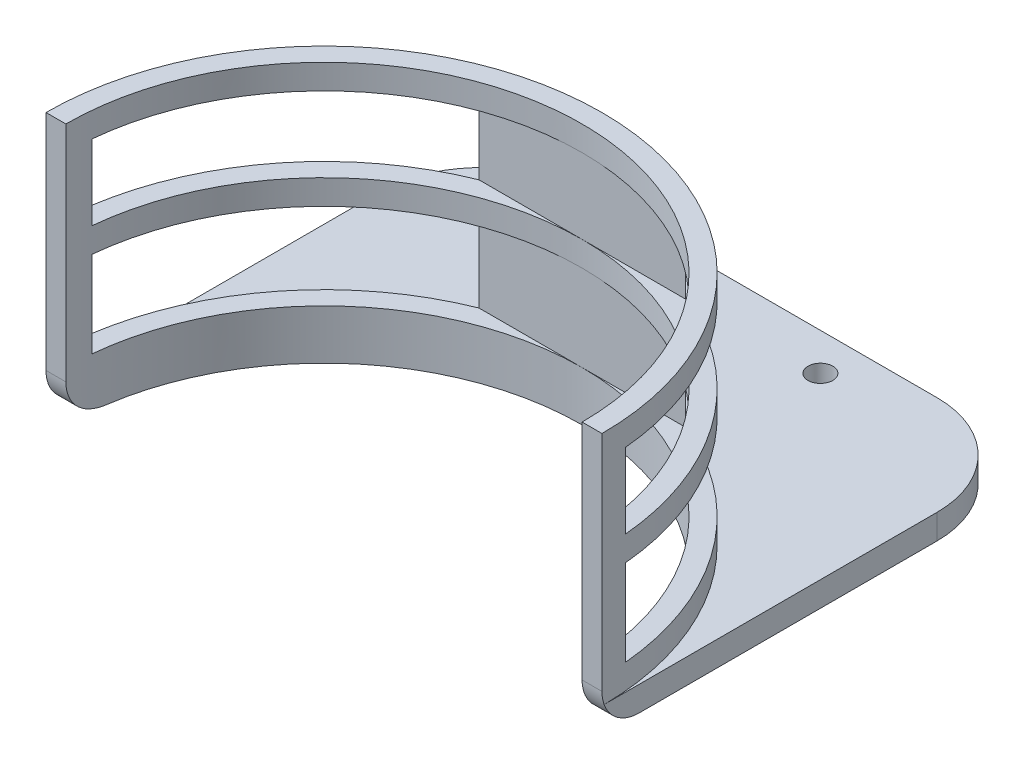
ISO-10303-21;
HEADER;
FILE_DESCRIPTION(('STEP AP214'),'2;1');
FILE_NAME('part.step','',(''),(''),'','','');
FILE_SCHEMA(('AUTOMOTIVE_DESIGN { 1 0 10303 214 1 1 1 1 }'));
ENDSEC;
DATA;
#1=APPLICATION_CONTEXT('core data for automotive mechanical design processes');
#2=APPLICATION_PROTOCOL_DEFINITION('international standard','automotive_design',2000,#1);
#3=PRODUCT_CONTEXT('',#1,'mechanical');
#4=PRODUCT('Part','Part','',(#3));
#5=PRODUCT_RELATED_PRODUCT_CATEGORY('part','',(#4));
#6=PRODUCT_DEFINITION_FORMATION('','',#4);
#7=PRODUCT_DEFINITION_CONTEXT('part definition',#1,'design');
#8=PRODUCT_DEFINITION('design','',#6,#7);
#9=PRODUCT_DEFINITION_SHAPE('','',#8);
#10=(LENGTH_UNIT() NAMED_UNIT(*) SI_UNIT(.MILLI.,.METRE.));
#11=(NAMED_UNIT(*) PLANE_ANGLE_UNIT() SI_UNIT($,.RADIAN.));
#12=(NAMED_UNIT(*) SI_UNIT($,.STERADIAN.) SOLID_ANGLE_UNIT());
#13=UNCERTAINTY_MEASURE_WITH_UNIT(LENGTH_MEASURE(1.E-05),#10,'distance_accuracy_value','');
#14=(GEOMETRIC_REPRESENTATION_CONTEXT(3) GLOBAL_UNCERTAINTY_ASSIGNED_CONTEXT((#13)) GLOBAL_UNIT_ASSIGNED_CONTEXT((#10,
#11,#12)) REPRESENTATION_CONTEXT('',''));
#15=CARTESIAN_POINT('',(0.,0.,0.));
#16=DIRECTION('',(0.,0.,1.));
#17=DIRECTION('',(1.,0.,0.));
#18=AXIS2_PLACEMENT_3D('',#15,#16,#17);
#19=CARTESIAN_POINT('',(-22.4,19.,0.));
#20=DIRECTION('',(0.,0.,-1.));
#21=DIRECTION('',(-1.,0.,0.));
#22=AXIS2_PLACEMENT_3D('',#19,#20,#21);
#23=PLANE('',#22);
#24=DIRECTION('',(0.,-1.,0.));
#25=VECTOR('',#24,1.);
#26=CARTESIAN_POINT('',(-22.4,19.,0.));
#27=LINE('',#26,#25);
#28=CARTESIAN_POINT('',(-22.4,19.,0.));
#29=VERTEX_POINT('',#28);
#30=CARTESIAN_POINT('',(-22.4,1.,0.));
#31=VERTEX_POINT('',#30);
#32=EDGE_CURVE('E392',#29,#31,#27,.T.);
#33=ORIENTED_EDGE('',*,*,#32,.T.);
#34=DIRECTION('',(-1.,0.,0.));
#35=VECTOR('',#34,1.);
#36=CARTESIAN_POINT('',(-20.8,1.,0.));
#37=LINE('',#36,#35);
#38=CARTESIAN_POINT('',(-20.8,1.,0.));
#39=VERTEX_POINT('',#38);
#40=EDGE_CURVE('E65',#31,#39,#37,.F.);
#41=ORIENTED_EDGE('',*,*,#40,.T.);
#42=DIRECTION('',(0.,-1.,0.));
#43=VECTOR('',#42,1.);
#44=CARTESIAN_POINT('',(-20.8,19.,0.));
#45=LINE('',#44,#43);
#46=CARTESIAN_POINT('',(-20.8,19.,0.));
#47=VERTEX_POINT('',#46);
#48=EDGE_CURVE('E390',#47,#39,#45,.T.);
#49=ORIENTED_EDGE('',*,*,#48,.F.);
#50=DIRECTION('',(1.,0.,0.));
#51=VECTOR('',#50,1.);
#52=CARTESIAN_POINT('',(-22.4,19.,0.));
#53=LINE('',#52,#51);
#54=EDGE_CURVE('E388',#29,#47,#53,.T.);
#55=ORIENTED_EDGE('',*,*,#54,.F.);
#56=EDGE_LOOP('',(#33,#41,#49,#55));
#57=FACE_BOUND('',#56,.T.);
#58=ADVANCED_FACE('F41',(#57),#23,.F.);
#59=CARTESIAN_POINT('',(0.,19.,0.));
#60=DIRECTION('',(0.,-1.,0.));
#61=DIRECTION('',(0.,0.,-1.));
#62=AXIS2_PLACEMENT_3D('',#59,#60,#61);
#63=CYLINDRICAL_SURFACE('',#62,20.8);
#64=DIRECTION('',(0.,-1.,0.));
#65=VECTOR('',#64,1.);
#66=CARTESIAN_POINT('',(-20.703622871372,19.,-2.00000000000001));
#67=LINE('',#66,#65);
#68=CARTESIAN_POINT('',(-20.703622871372,1.99999999999999,-2.));
#69=VERTEX_POINT('',#68);
#70=CARTESIAN_POINT('',(-20.703622871372,8.94485109083248,-2.));
#71=VERTEX_POINT('',#70);
#72=EDGE_CURVE('E452',#69,#71,#67,.F.);
#73=ORIENTED_EDGE('',*,*,#72,.T.);
#74=CARTESIAN_POINT('',(0.,8.94485109083248,0.));
#75=DIRECTION('',(0.,1.,0.));
#76=DIRECTION('',(0.,0.,1.));
#77=AXIS2_PLACEMENT_3D('',#74,#75,#76);
#78=CIRCLE('',#77,20.8);
#79=CARTESIAN_POINT('',(0.,8.94485109083248,-20.8));
#80=VERTEX_POINT('',#79);
#81=EDGE_CURVE('E458',#71,#80,#78,.F.);
#82=ORIENTED_EDGE('',*,*,#81,.T.);
#83=CARTESIAN_POINT('',(20.703622871372,8.94485109083248,-2.));
#84=VERTEX_POINT('',#83);
#85=EDGE_CURVE('E455',#80,#84,#78,.F.);
#86=ORIENTED_EDGE('',*,*,#85,.T.);
#87=DIRECTION('',(0.,-1.,0.));
#88=VECTOR('',#87,1.);
#89=CARTESIAN_POINT('',(20.703622871372,19.,-2.));
#90=LINE('',#89,#88);
#91=CARTESIAN_POINT('',(20.703622871372,1.99999999999999,-2.));
#92=VERTEX_POINT('',#91);
#93=EDGE_CURVE('E449',#84,#92,#90,.T.);
#94=ORIENTED_EDGE('',*,*,#93,.T.);
#95=CARTESIAN_POINT('',(0.,1.99999999999999,0.));
#96=DIRECTION('',(0.,-1.,0.));
#97=DIRECTION('',(0.,0.,-1.));
#98=AXIS2_PLACEMENT_3D('',#95,#96,#97);
#99=CIRCLE('',#98,20.8);
#100=CARTESIAN_POINT('',(0.,2.,-20.8));
#101=VERTEX_POINT('',#100);
#102=EDGE_CURVE('E445',#92,#101,#99,.F.);
#103=ORIENTED_EDGE('',*,*,#102,.T.);
#104=EDGE_CURVE('E448',#101,#69,#99,.F.);
#105=ORIENTED_EDGE('',*,*,#104,.T.);
#106=EDGE_LOOP('',(#73,#82,#86,#94,#103,#105));
#107=FACE_BOUND('',#106,.T.);
#108=DIRECTION('',(0.,-1.,0.));
#109=VECTOR('',#108,1.);
#110=CARTESIAN_POINT('',(-20.703622871372,19.,-2.));
#111=LINE('',#110,#109);
#112=CARTESIAN_POINT('',(-20.703622871372,10.9448510908325,-2.));
#113=VERTEX_POINT('',#112);
#114=CARTESIAN_POINT('',(-20.703622871372,17.,-2.));
#115=VERTEX_POINT('',#114);
#116=EDGE_CURVE('E438',#113,#115,#111,.F.);
#117=ORIENTED_EDGE('',*,*,#116,.T.);
#118=CARTESIAN_POINT('',(0.,17.,0.));
#119=DIRECTION('',(0.,1.,0.));
#120=DIRECTION('',(0.,0.,1.));
#121=AXIS2_PLACEMENT_3D('',#118,#119,#120);
#122=CIRCLE('',#121,20.8);
#123=CARTESIAN_POINT('',(0.,17.,-20.8));
#124=VERTEX_POINT('',#123);
#125=EDGE_CURVE('E444',#115,#124,#122,.F.);
#126=ORIENTED_EDGE('',*,*,#125,.T.);
#127=CARTESIAN_POINT('',(20.703622871372,17.,-2.));
#128=VERTEX_POINT('',#127);
#129=EDGE_CURVE('E441',#124,#128,#122,.F.);
#130=ORIENTED_EDGE('',*,*,#129,.T.);
#131=DIRECTION('',(0.,-1.,0.));
#132=VECTOR('',#131,1.);
#133=CARTESIAN_POINT('',(20.703622871372,19.,-2.));
#134=LINE('',#133,#132);
#135=CARTESIAN_POINT('',(20.703622871372,10.9448510908325,-2.));
#136=VERTEX_POINT('',#135);
#137=EDGE_CURVE('E435',#128,#136,#134,.T.);
#138=ORIENTED_EDGE('',*,*,#137,.T.);
#139=CARTESIAN_POINT('',(0.,10.9448510908325,0.));
#140=DIRECTION('',(0.,-1.,0.));
#141=DIRECTION('',(0.,0.,-1.));
#142=AXIS2_PLACEMENT_3D('',#139,#140,#141);
#143=CIRCLE('',#142,20.8);
#144=CARTESIAN_POINT('',(0.,10.9448510908325,-20.8));
#145=VERTEX_POINT('',#144);
#146=EDGE_CURVE('E430',#136,#145,#143,.F.);
#147=ORIENTED_EDGE('',*,*,#146,.T.);
#148=EDGE_CURVE('E433',#145,#113,#143,.F.);
#149=ORIENTED_EDGE('',*,*,#148,.T.);
#150=EDGE_LOOP('',(#117,#126,#130,#138,#147,#149));
#151=FACE_BOUND('',#150,.T.);
#152=ORIENTED_EDGE('',*,*,#48,.T.);
#153=CARTESIAN_POINT('',(-20.8,1.,0.));
#154=CARTESIAN_POINT('',(-20.799996178238,0.915637504627732,8.07638701506427E-06));
#155=CARTESIAN_POINT('',(-20.7999999002505,0.831278842566488,-0.00355848715215176));
#156=CARTESIAN_POINT('',(-20.7999946279851,0.663164771669014,-0.0177783895427865));
#157=CARTESIAN_POINT('',(-20.799985634306,0.579409334612615,-0.028431394669652));
#158=CARTESIAN_POINT('',(-20.7999271527408,0.41314907582282,-0.0567514950856048));
#159=CARTESIAN_POINT('',(-20.7998776939941,0.330643397649984,-0.0744135383448187));
#160=CARTESIAN_POINT('',(-20.7996837292595,0.167433063205999,-0.116608437741064));
#161=CARTESIAN_POINT('',(-20.7995392244334,0.0867283849341041,-0.141141209896637));
#162=CARTESIAN_POINT('',(-20.7988607685187,-0.151907380078366,-0.224848098416716));
#163=CARTESIAN_POINT('',(-20.7980819545741,-0.306425937224004,-0.294142044453463));
#164=CARTESIAN_POINT('',(-20.7951246333974,-0.601517495336244,-0.45763301946517));
#165=CARTESIAN_POINT('',(-20.7929463681534,-0.742092902450865,-0.551825741378135));
#166=CARTESIAN_POINT('',(-20.7862904198567,-1.0053179130419,-0.762353921403687));
#167=CARTESIAN_POINT('',(-20.7818147594851,-1.1279831632262,-0.878669845115321));
#168=CARTESIAN_POINT('',(-20.7696553394551,-1.35202042770812,-1.13014388689984));
#169=CARTESIAN_POINT('',(-20.761971232208,-1.45339013315288,-1.26530404541554));
#170=CARTESIAN_POINT('',(-20.7426570726871,-1.63164582273508,-1.54998095851094));
#171=CARTESIAN_POINT('',(-20.7310407844233,-1.70861542026951,-1.69944634834245));
#172=CARTESIAN_POINT('',(-20.7033568419038,-1.83643819220612,-2.00874640367957));
#173=CARTESIAN_POINT('',(-20.6872911596892,-1.88730290827077,-2.16857645142723));
#174=CARTESIAN_POINT('',(-20.6565550136728,-1.94964069198621,-2.44110574627691));
#175=CARTESIAN_POINT('',(-20.6431173088623,-1.96853586340579,-2.55230770228631));
#176=CARTESIAN_POINT('',(-20.6142731014111,-1.99371498337631,-2.77570657710581));
#177=CARTESIAN_POINT('',(-20.5988695903733,-2.00001785730717,-2.88790174786212));
#178=CARTESIAN_POINT('',(-20.5825168529021,-2.,-3.));
#179=B_SPLINE_CURVE_WITH_KNOTS('',3,(#153,#154,#155,#156,#157,#158,#159,#160,#161,#162,#163,
#164,#165,#166,#167,#168,#169,#170,#171,#172,#173,#174,#175,#176,#177,#178),.UNSPECIFIED.,.F.,
.F.,(4,2,2,2,2,2,2,2,2,2,2,2,4),(0.,0.253005206547401,0.505998499063771,0.758809767327582,
1.01161794559423,1.51703673095991,2.02236814467616,2.52725541378974,3.03219739432326,
3.53538987043164,4.03835967968997,4.378462218881,4.71805322104556),.UNSPECIFIED.);
#180=CARTESIAN_POINT('',(-20.5825168529021,-2.,-3.));
#181=VERTEX_POINT('',#180);
#182=EDGE_CURVE('E318',#39,#181,#179,.T.);
#183=ORIENTED_EDGE('',*,*,#182,.T.);
#184=CARTESIAN_POINT('',(0.,-2.,0.));
#185=DIRECTION('',(0.,1.,0.));
#186=DIRECTION('',(0.,0.,1.));
#187=AXIS2_PLACEMENT_3D('',#184,#185,#186);
#188=CIRCLE('',#187,20.8);
#189=CARTESIAN_POINT('',(20.5825168529021,-2.,-3.));
#190=VERTEX_POINT('',#189);
#191=EDGE_CURVE('E462',#190,#181,#188,.T.);
#192=ORIENTED_EDGE('',*,*,#191,.F.);
#193=CARTESIAN_POINT('',(20.5825168529021,-2.,-3.));
#194=CARTESIAN_POINT('',(20.5946797203891,-2.00000826346786,-2.91658633129674));
#195=CARTESIAN_POINT('',(20.6063258289189,-1.99652102882441,-2.83309824411233));
#196=CARTESIAN_POINT('',(20.6285352235014,-1.98258070193753,-2.66655938029355));
#197=CARTESIAN_POINT('',(20.6390984887236,-1.9721274757191,-2.58350861210098));
#198=CARTESIAN_POINT('',(20.6590863752872,-1.9442887255233,-2.41848369802251));
#199=CARTESIAN_POINT('',(20.6685116813041,-1.92690739733012,-2.33650893147143));
#200=CARTESIAN_POINT('',(20.6862151535349,-1.88532421629418,-2.17420813070596));
#201=CARTESIAN_POINT('',(20.6944933583359,-1.86112259296065,-2.09388204110964));
#202=CARTESIAN_POINT('',(20.7176269651027,-1.77842418606544,-1.85612018249281));
#203=CARTESIAN_POINT('',(20.7307826799179,-1.70983199899531,-1.70188976919358));
#204=CARTESIAN_POINT('',(20.7528866532154,-1.54768317600294,-1.40699726807194));
#205=CARTESIAN_POINT('',(20.7618360993509,-1.45413359858673,-1.26633135919603));
#206=CARTESIAN_POINT('',(20.7762059533612,-1.24523675345888,-1.0032639328106));
#207=CARTESIAN_POINT('',(20.7816452303307,-1.13001040801849,-0.880767532074193));
#208=CARTESIAN_POINT('',(20.7899354352502,-0.880655363114886,-0.656659210775934));
#209=CARTESIAN_POINT('',(20.7927857516974,-0.746522206571072,-0.555052228599203));
#210=CARTESIAN_POINT('',(20.7968069600466,-0.462821454933926,-0.375419836611743));
#211=CARTESIAN_POINT('',(20.7979736422696,-0.313216170455953,-0.297453920524486));
#212=CARTESIAN_POINT('',(20.799425879958,-0.00309510796441806,-0.167683651714423));
#213=CARTESIAN_POINT('',(20.7997119069277,0.157414784636211,-0.11586531196671));
#214=CARTESIAN_POINT('',(20.7999512144328,0.432318003762549,-0.051981451168707));
#215=CARTESIAN_POINT('',(20.7999816493285,0.545045767266178,-0.0325027837856516));
#216=CARTESIAN_POINT('',(20.8000000596496,0.771833717449581,-0.00651186747753463));
#217=CARTESIAN_POINT('',(20.7999880915532,0.885891930252245,1.76109207277203E-05));
#218=CARTESIAN_POINT('',(20.8,1.,0.));
#219=B_SPLINE_CURVE_WITH_KNOTS('',3,(#193,#194,#195,#196,#197,#198,#199,#200,#201,#202,#203,
#204,#205,#206,#207,#208,#209,#210,#211,#212,#213,#214,#215,#216,#217,#218),.UNSPECIFIED.,.F.,
.F.,(4,2,2,2,2,2,2,2,2,2,2,2,4),(0.,0.252810922803381,0.505626707989336,0.758289615419527,
1.01094402152491,1.51621939792573,2.02135202240967,2.52374614959434,3.02625890956897,
3.53002596445877,4.03352325469367,4.37602021845661,4.71806116818211),.UNSPECIFIED.);
#220=CARTESIAN_POINT('',(20.8,1.,0.));
#221=VERTEX_POINT('',#220);
#222=EDGE_CURVE('E57',#190,#221,#219,.T.);
#223=ORIENTED_EDGE('',*,*,#222,.T.);
#224=DIRECTION('',(0.,-1.,0.));
#225=VECTOR('',#224,1.);
#226=CARTESIAN_POINT('',(20.8,19.,0.));
#227=LINE('',#226,#225);
#228=CARTESIAN_POINT('',(20.8,19.,0.));
#229=VERTEX_POINT('',#228);
#230=EDGE_CURVE('E352',#229,#221,#227,.T.);
#231=ORIENTED_EDGE('',*,*,#230,.F.);
#232=CARTESIAN_POINT('',(0.,19.,0.));
#233=DIRECTION('',(0.,-1.,0.));
#234=DIRECTION('',(0.,0.,1.));
#235=AXIS2_PLACEMENT_3D('',#232,#233,#234);
#236=CIRCLE('',#235,20.8);
#237=EDGE_CURVE('E379',#47,#229,#236,.T.);
#238=ORIENTED_EDGE('',*,*,#237,.F.);
#239=EDGE_LOOP('',(#152,#183,#192,#223,#231,#238));
#240=FACE_BOUND('',#239,.T.);
#241=ADVANCED_FACE('F301',(#107,#151,#240),#63,.F.);
#242=CARTESIAN_POINT('',(0.,19.,0.));
#243=DIRECTION('',(0.,-1.,0.));
#244=DIRECTION('',(0.,0.,-1.));
#245=AXIS2_PLACEMENT_3D('',#242,#243,#244);
#246=CYLINDRICAL_SURFACE('',#245,22.4);
#247=CARTESIAN_POINT('',(0.,8.94485109083248,0.));
#248=DIRECTION('',(0.,1.,0.));
#249=DIRECTION('',(0.,0.,1.));
#250=AXIS2_PLACEMENT_3D('',#247,#248,#249);
#251=CIRCLE('',#250,22.4);
#252=CARTESIAN_POINT('',(22.3105356278149,8.94485109083248,-2.));
#253=VERTEX_POINT('',#252);
#254=CARTESIAN_POINT('',(8.3138438763306,8.94485109083248,-20.8));
#255=VERTEX_POINT('',#254);
#256=EDGE_CURVE('E262',#253,#255,#251,.T.);
#257=ORIENTED_EDGE('',*,*,#256,.T.);
#258=DIRECTION('',(0.,-1.,0.));
#259=VECTOR('',#258,1.);
#260=CARTESIAN_POINT('',(8.31384387633061,19.,-20.8));
#261=LINE('',#260,#259);
#262=CARTESIAN_POINT('',(8.3138438763306,2.,-20.8));
#263=VERTEX_POINT('',#262);
#264=EDGE_CURVE('E268',#255,#263,#261,.T.);
#265=ORIENTED_EDGE('',*,*,#264,.T.);
#266=CARTESIAN_POINT('',(0.,1.99999999999999,0.));
#267=DIRECTION('',(0.,-1.,0.));
#268=DIRECTION('',(0.,0.,-1.));
#269=AXIS2_PLACEMENT_3D('',#266,#267,#268);
#270=CIRCLE('',#269,22.4);
#271=CARTESIAN_POINT('',(22.3105356278149,1.99999999999999,-2.));
#272=VERTEX_POINT('',#271);
#273=EDGE_CURVE('E250',#263,#272,#270,.T.);
#274=ORIENTED_EDGE('',*,*,#273,.T.);
#275=DIRECTION('',(0.,-1.,0.));
#276=VECTOR('',#275,1.);
#277=CARTESIAN_POINT('',(22.3105356278149,19.,-2.));
#278=LINE('',#277,#276);
#279=EDGE_CURVE('E265',#272,#253,#278,.F.);
#280=ORIENTED_EDGE('',*,*,#279,.T.);
#281=EDGE_LOOP('',(#257,#265,#274,#280));
#282=FACE_BOUND('',#281,.T.);
#283=CARTESIAN_POINT('',(-22.3105356278149,1.99999999999999,-2.));
#284=VERTEX_POINT('',#283);
#285=CARTESIAN_POINT('',(-8.3138438763306,2.,-20.8));
#286=VERTEX_POINT('',#285);
#287=EDGE_CURVE('E245',#284,#286,#270,.T.);
#288=ORIENTED_EDGE('',*,*,#287,.T.);
#289=DIRECTION('',(0.,-1.,0.));
#290=VECTOR('',#289,1.);
#291=CARTESIAN_POINT('',(-8.31384387633061,19.,-20.8));
#292=LINE('',#291,#290);
#293=CARTESIAN_POINT('',(-8.3138438763306,8.94485109083248,-20.8));
#294=VERTEX_POINT('',#293);
#295=EDGE_CURVE('E261',#286,#294,#292,.F.);
#296=ORIENTED_EDGE('',*,*,#295,.T.);
#297=CARTESIAN_POINT('',(-22.3105356278149,8.94485109083248,-2.));
#298=VERTEX_POINT('',#297);
#299=EDGE_CURVE('E258',#294,#298,#251,.T.);
#300=ORIENTED_EDGE('',*,*,#299,.T.);
#301=DIRECTION('',(0.,-1.,0.));
#302=VECTOR('',#301,1.);
#303=CARTESIAN_POINT('',(-22.3105356278149,19.,-2.00000000000001));
#304=LINE('',#303,#302);
#305=EDGE_CURVE('E248',#298,#284,#304,.T.);
#306=ORIENTED_EDGE('',*,*,#305,.T.);
#307=EDGE_LOOP('',(#288,#296,#300,#306));
#308=FACE_BOUND('',#307,.T.);
#309=CARTESIAN_POINT('',(0.,17.,0.));
#310=DIRECTION('',(0.,1.,0.));
#311=DIRECTION('',(0.,0.,1.));
#312=AXIS2_PLACEMENT_3D('',#309,#310,#311);
#313=CIRCLE('',#312,22.4);
#314=CARTESIAN_POINT('',(22.3105356278149,17.,-2.));
#315=VERTEX_POINT('',#314);
#316=CARTESIAN_POINT('',(8.3138438763306,17.,-20.8));
#317=VERTEX_POINT('',#316);
#318=EDGE_CURVE('E244',#315,#317,#313,.T.);
#319=ORIENTED_EDGE('',*,*,#318,.T.);
#320=DIRECTION('',(0.,-1.,0.));
#321=VECTOR('',#320,1.);
#322=CARTESIAN_POINT('',(8.31384387633061,19.,-20.8));
#323=LINE('',#322,#321);
#324=CARTESIAN_POINT('',(8.3138438763306,10.9448510908325,-20.8));
#325=VERTEX_POINT('',#324);
#326=EDGE_CURVE('E234',#317,#325,#323,.T.);
#327=ORIENTED_EDGE('',*,*,#326,.T.);
#328=CARTESIAN_POINT('',(0.,10.9448510908325,0.));
#329=DIRECTION('',(0.,-1.,0.));
#330=DIRECTION('',(0.,0.,-1.));
#331=AXIS2_PLACEMENT_3D('',#328,#329,#330);
#332=CIRCLE('',#331,22.4);
#333=CARTESIAN_POINT('',(22.3105356278149,10.9448510908325,-2.));
#334=VERTEX_POINT('',#333);
#335=EDGE_CURVE('E216',#325,#334,#332,.T.);
#336=ORIENTED_EDGE('',*,*,#335,.T.);
#337=DIRECTION('',(0.,-1.,0.));
#338=VECTOR('',#337,1.);
#339=CARTESIAN_POINT('',(22.3105356278149,19.,-2.));
#340=LINE('',#339,#338);
#341=EDGE_CURVE('E227',#334,#315,#340,.F.);
#342=ORIENTED_EDGE('',*,*,#341,.T.);
#343=EDGE_LOOP('',(#319,#327,#336,#342));
#344=FACE_BOUND('',#343,.T.);
#345=CARTESIAN_POINT('',(-22.3105356278149,10.9448510908325,-2.));
#346=VERTEX_POINT('',#345);
#347=CARTESIAN_POINT('',(-8.3138438763306,10.9448510908325,-20.8));
#348=VERTEX_POINT('',#347);
#349=EDGE_CURVE('E230',#346,#348,#332,.T.);
#350=ORIENTED_EDGE('',*,*,#349,.T.);
#351=DIRECTION('',(0.,-1.,0.));
#352=VECTOR('',#351,1.);
#353=CARTESIAN_POINT('',(-8.31384387633061,19.,-20.8));
#354=LINE('',#353,#352);
#355=CARTESIAN_POINT('',(-8.3138438763306,17.,-20.8));
#356=VERTEX_POINT('',#355);
#357=EDGE_CURVE('E228',#348,#356,#354,.F.);
#358=ORIENTED_EDGE('',*,*,#357,.T.);
#359=CARTESIAN_POINT('',(-22.3105356278149,17.,-2.));
#360=VERTEX_POINT('',#359);
#361=EDGE_CURVE('E252',#356,#360,#313,.T.);
#362=ORIENTED_EDGE('',*,*,#361,.T.);
#363=DIRECTION('',(0.,-1.,0.));
#364=VECTOR('',#363,1.);
#365=CARTESIAN_POINT('',(-22.3105356278149,19.,-2.));
#366=LINE('',#365,#364);
#367=EDGE_CURVE('E415',#360,#346,#366,.T.);
#368=ORIENTED_EDGE('',*,*,#367,.T.);
#369=EDGE_LOOP('',(#350,#358,#362,#368));
#370=FACE_BOUND('',#369,.T.);
#371=CARTESIAN_POINT('',(0.,0.,0.));
#372=DIRECTION('',(0.,1.,0.));
#373=DIRECTION('',(0.,0.,1.));
#374=AXIS2_PLACEMENT_3D('',#371,#372,#373);
#375=CIRCLE('',#374,22.4);
#376=CARTESIAN_POINT('',(22.3993429088551,0.,-0.17157287525381));
#377=VERTEX_POINT('',#376);
#378=CARTESIAN_POINT('',(-22.3993429088551,0.,-0.17157287525381));
#379=VERTEX_POINT('',#378);
#380=EDGE_CURVE('E370',#377,#379,#375,.T.);
#381=ORIENTED_EDGE('',*,*,#380,.T.);
#382=CARTESIAN_POINT('',(-22.3993429088551,0.,-0.17157287525381));
#383=CARTESIAN_POINT('',(-22.3995577094715,0.0803861653857642,-0.143142823282956));
#384=CARTESIAN_POINT('',(-22.3996979224296,0.161988537956702,-0.118156862541187));
#385=CARTESIAN_POINT('',(-22.3998840713442,0.326431722070513,-0.075370262345239));
#386=CARTESIAN_POINT('',(-22.3999306753673,0.409259476963428,-0.0575194398015468));
#387=CARTESIAN_POINT('',(-22.3999859934701,0.576128252899772,-0.028889270526174));
#388=CARTESIAN_POINT('',(-22.3999947075525,0.660169273857381,-0.0181099232942898));
#389=CARTESIAN_POINT('',(-22.4000000090714,0.829470085540923,-0.00363509920537357));
#390=CARTESIAN_POINT('',(-22.3999965085711,0.91473429482711,8.71268519810776E-06));
#391=CARTESIAN_POINT('',(-22.4,1.,0.));
#392=B_SPLINE_CURVE_WITH_KNOTS('',3,(#382,#383,#384,#385,#386,#387,#388,#389,#390,#391),
.UNSPECIFIED.,.F.,.F.,(4,2,2,2,4),(0.,0.255716942626612,0.509602311126768,0.76348766166824,
1.01920457440944),.UNSPECIFIED.);
#393=EDGE_CURVE('E290',#379,#31,#392,.T.);
#394=ORIENTED_EDGE('',*,*,#393,.T.);
#395=ORIENTED_EDGE('',*,*,#32,.F.);
#396=CARTESIAN_POINT('',(0.,19.,0.));
#397=DIRECTION('',(0.,1.,0.));
#398=DIRECTION('',(0.,0.,1.));
#399=AXIS2_PLACEMENT_3D('',#396,#397,#398);
#400=CIRCLE('',#399,22.4);
#401=CARTESIAN_POINT('',(22.4,19.,0.));
#402=VERTEX_POINT('',#401);
#403=EDGE_CURVE('E485',#402,#29,#400,.T.);
#404=ORIENTED_EDGE('',*,*,#403,.F.);
#405=DIRECTION('',(0.,-1.,0.));
#406=VECTOR('',#405,1.);
#407=CARTESIAN_POINT('',(22.4,19.,0.));
#408=LINE('',#407,#406);
#409=CARTESIAN_POINT('',(22.4,1.,0.));
#410=VERTEX_POINT('',#409);
#411=EDGE_CURVE('E360',#402,#410,#408,.T.);
#412=ORIENTED_EDGE('',*,*,#411,.T.);
#413=CARTESIAN_POINT('',(22.4,1.,0.));
#414=CARTESIAN_POINT('',(22.3999965085711,0.91473429482711,8.71268519827603E-06));
#415=CARTESIAN_POINT('',(22.4000000090714,0.829470085540923,-0.00363509920537343));
#416=CARTESIAN_POINT('',(22.3999947075525,0.660169273857381,-0.0181099232942897));
#417=CARTESIAN_POINT('',(22.3999859934701,0.576128252899772,-0.0288892705261739));
#418=CARTESIAN_POINT('',(22.3999306753673,0.409259476963428,-0.0575194398015467));
#419=CARTESIAN_POINT('',(22.3998840713442,0.326431722070513,-0.0753702623452389));
#420=CARTESIAN_POINT('',(22.3996979224296,0.161988537956702,-0.118156862541187));
#421=CARTESIAN_POINT('',(22.3995577094715,0.0803861653857641,-0.143142823282956));
#422=CARTESIAN_POINT('',(22.3993429088551,0.,-0.17157287525381));
#423=B_SPLINE_CURVE_WITH_KNOTS('',3,(#413,#414,#415,#416,#417,#418,#419,#420,#421,#422),
.UNSPECIFIED.,.F.,.F.,(4,2,2,2,4),(0.,0.255716912741199,0.50960226328267,0.763487631782827,
1.01920457440944),.UNSPECIFIED.);
#424=EDGE_CURVE('E283',#410,#377,#423,.T.);
#425=ORIENTED_EDGE('',*,*,#424,.T.);
#426=EDGE_LOOP('',(#381,#394,#395,#404,#412,#425));
#427=FACE_BOUND('',#426,.T.);
#428=ADVANCED_FACE('F242',(#282,#308,#344,#370,#427),#246,.T.);
#429=ORIENTED_EDGE('',*,*,#230,.T.);
#430=DIRECTION('',(-1.,0.,0.));
#431=VECTOR('',#430,1.);
#432=CARTESIAN_POINT('',(22.4,1.,0.));
#433=LINE('',#432,#431);
#434=EDGE_CURVE('E50',#221,#410,#433,.F.);
#435=ORIENTED_EDGE('',*,*,#434,.T.);
#436=ORIENTED_EDGE('',*,*,#411,.F.);
#437=DIRECTION('',(1.,0.,0.));
#438=VECTOR('',#437,1.);
#439=CARTESIAN_POINT('',(20.8,19.,0.));
#440=LINE('',#439,#438);
#441=EDGE_CURVE('E356',#229,#402,#440,.T.);
#442=ORIENTED_EDGE('',*,*,#441,.F.);
#443=EDGE_LOOP('',(#429,#435,#436,#442));
#444=FACE_BOUND('',#443,.T.);
#445=ADVANCED_FACE('F300',(#444),#23,.F.);
#446=CARTESIAN_POINT('',(0.,19.,0.));
#447=DIRECTION('',(0.,1.,0.));
#448=DIRECTION('',(0.,0.,1.));
#449=AXIS2_PLACEMENT_3D('',#446,#447,#448);
#450=PLANE('',#449);
#451=ORIENTED_EDGE('',*,*,#237,.T.);
#452=ORIENTED_EDGE('',*,*,#441,.T.);
#453=ORIENTED_EDGE('',*,*,#403,.T.);
#454=ORIENTED_EDGE('',*,*,#54,.T.);
#455=EDGE_LOOP('',(#451,#452,#453,#454));
#456=FACE_BOUND('',#455,.T.);
#457=ADVANCED_FACE('F345',(#456),#450,.T.);
#458=CARTESIAN_POINT('',(-22.4,-2.,-1.56418363980172E-13));
#459=DIRECTION('',(1.,0.,0.));
#460=DIRECTION('',(0.,0.,-1.));
#461=AXIS2_PLACEMENT_3D('',#458,#459,#460);
#462=PLANE('',#461);
#463=DIRECTION('',(0.,0.,-1.));
#464=VECTOR('',#463,1.);
#465=CARTESIAN_POINT('',(-22.4,-2.,-1.56418363980172E-13));
#466=LINE('',#465,#464);
#467=CARTESIAN_POINT('',(-22.4,-2.,-3.));
#468=VERTEX_POINT('',#467);
#469=CARTESIAN_POINT('',(-22.4,-2.,-27.));
#470=VERTEX_POINT('',#469);
#471=EDGE_CURVE('E475',#468,#470,#466,.T.);
#472=ORIENTED_EDGE('',*,*,#471,.F.);
#473=CARTESIAN_POINT('',(-22.4,1.,-3.));
#474=DIRECTION('',(1.,0.,0.));
#475=DIRECTION('',(0.,0.,-1.));
#476=AXIS2_PLACEMENT_3D('',#473,#474,#475);
#477=CIRCLE('',#476,3.);
#478=CARTESIAN_POINT('',(-22.4,0.,-0.17157287525381));
#479=VERTEX_POINT('',#478);
#480=EDGE_CURVE('E277',#468,#479,#477,.F.);
#481=ORIENTED_EDGE('',*,*,#480,.T.);
#482=DIRECTION('',(0.,0.,-1.));
#483=VECTOR('',#482,1.);
#484=CARTESIAN_POINT('',(-22.4,0.,-1.56418363980172E-13));
#485=LINE('',#484,#483);
#486=CARTESIAN_POINT('',(-22.4,0.,-27.));
#487=VERTEX_POINT('',#486);
#488=EDGE_CURVE('E474',#479,#487,#485,.T.);
#489=ORIENTED_EDGE('',*,*,#488,.T.);
#490=DIRECTION('',(0.,1.,0.));
#491=VECTOR('',#490,1.);
#492=CARTESIAN_POINT('',(-22.4,-2.,-27.));
#493=LINE('',#492,#491);
#494=EDGE_CURVE('E411',#487,#470,#493,.F.);
#495=ORIENTED_EDGE('',*,*,#494,.T.);
#496=EDGE_LOOP('',(#472,#481,#489,#495));
#497=FACE_BOUND('',#496,.T.);
#498=ADVANCED_FACE('F350',(#497),#462,.F.);
#499=CARTESIAN_POINT('',(-22.4,-2.,-35.));
#500=DIRECTION('',(0.,0.,1.));
#501=DIRECTION('',(1.,0.,0.));
#502=AXIS2_PLACEMENT_3D('',#499,#500,#501);
#503=PLANE('',#502);
#504=DIRECTION('',(1.,0.,0.));
#505=VECTOR('',#504,1.);
#506=CARTESIAN_POINT('',(-22.4,0.,-35.));
#507=LINE('',#506,#505);
#508=CARTESIAN_POINT('',(-14.4,0.,-35.));
#509=VERTEX_POINT('',#508);
#510=CARTESIAN_POINT('',(14.4,0.,-35.));
#511=VERTEX_POINT('',#510);
#512=EDGE_CURVE('E481',#509,#511,#507,.T.);
#513=ORIENTED_EDGE('',*,*,#512,.T.);
#514=DIRECTION('',(0.,1.,0.));
#515=VECTOR('',#514,1.);
#516=CARTESIAN_POINT('',(14.4,-2.,-35.));
#517=LINE('',#516,#515);
#518=CARTESIAN_POINT('',(14.4,-2.,-35.));
#519=VERTEX_POINT('',#518);
#520=EDGE_CURVE('E405',#511,#519,#517,.F.);
#521=ORIENTED_EDGE('',*,*,#520,.T.);
#522=DIRECTION('',(1.,0.,0.));
#523=VECTOR('',#522,1.);
#524=CARTESIAN_POINT('',(-22.4,-2.,-35.));
#525=LINE('',#524,#523);
#526=CARTESIAN_POINT('',(-14.4,-2.,-35.));
#527=VERTEX_POINT('',#526);
#528=EDGE_CURVE('E384',#527,#519,#525,.T.);
#529=ORIENTED_EDGE('',*,*,#528,.F.);
#530=DIRECTION('',(0.,1.,0.));
#531=VECTOR('',#530,1.);
#532=CARTESIAN_POINT('',(-14.4,-2.,-35.));
#533=LINE('',#532,#531);
#534=EDGE_CURVE('E402',#527,#509,#533,.T.);
#535=ORIENTED_EDGE('',*,*,#534,.T.);
#536=EDGE_LOOP('',(#513,#521,#529,#535));
#537=FACE_BOUND('',#536,.T.);
#538=ADVANCED_FACE('F499',(#537),#503,.F.);
#539=CARTESIAN_POINT('',(22.4,-2.,0.));
#540=DIRECTION('',(-1.,0.,0.));
#541=DIRECTION('',(0.,0.,1.));
#542=AXIS2_PLACEMENT_3D('',#539,#540,#541);
#543=PLANE('',#542);
#544=DIRECTION('',(0.,0.,1.));
#545=VECTOR('',#544,1.);
#546=CARTESIAN_POINT('',(22.4,0.,0.));
#547=LINE('',#546,#545);
#548=CARTESIAN_POINT('',(22.4,0.,-27.));
#549=VERTEX_POINT('',#548);
#550=CARTESIAN_POINT('',(22.4,0.,-0.17157287525381));
#551=VERTEX_POINT('',#550);
#552=EDGE_CURVE('E477',#549,#551,#547,.T.);
#553=ORIENTED_EDGE('',*,*,#552,.T.);
#554=CARTESIAN_POINT('',(22.4,1.,-3.));
#555=DIRECTION('',(-1.,0.,0.));
#556=DIRECTION('',(0.,0.,1.));
#557=AXIS2_PLACEMENT_3D('',#554,#555,#556);
#558=CIRCLE('',#557,3.);
#559=CARTESIAN_POINT('',(22.4,-2.,-3.));
#560=VERTEX_POINT('',#559);
#561=EDGE_CURVE('E11',#551,#560,#558,.F.);
#562=ORIENTED_EDGE('',*,*,#561,.T.);
#563=DIRECTION('',(0.,0.,1.));
#564=VECTOR('',#563,1.);
#565=CARTESIAN_POINT('',(22.4,-2.,0.));
#566=LINE('',#565,#564);
#567=CARTESIAN_POINT('',(22.4,-2.,-27.));
#568=VERTEX_POINT('',#567);
#569=EDGE_CURVE('E380',#568,#560,#566,.T.);
#570=ORIENTED_EDGE('',*,*,#569,.F.);
#571=DIRECTION('',(0.,1.,0.));
#572=VECTOR('',#571,1.);
#573=CARTESIAN_POINT('',(22.4,-2.,-27.));
#574=LINE('',#573,#572);
#575=EDGE_CURVE('E359',#568,#549,#574,.T.);
#576=ORIENTED_EDGE('',*,*,#575,.T.);
#577=EDGE_LOOP('',(#553,#562,#570,#576));
#578=FACE_BOUND('',#577,.T.);
#579=ADVANCED_FACE('F505',(#578),#543,.F.);
#580=CARTESIAN_POINT('',(0.,-2.,0.));
#581=DIRECTION('',(0.,-1.,0.));
#582=DIRECTION('',(0.,0.,-1.));
#583=AXIS2_PLACEMENT_3D('',#580,#581,#582);
#584=PLANE('',#583);
#585=CARTESIAN_POINT('',(-8.,-2.,-32.));
#586=DIRECTION('',(0.,1.,0.));
#587=DIRECTION('',(0.,0.,1.));
#588=AXIS2_PLACEMENT_3D('',#585,#586,#587);
#589=CIRCLE('',#588,1.);
#590=CARTESIAN_POINT('',(-8.,-2.,-31.));
#591=VERTEX_POINT('',#590);
#592=EDGE_CURVE('E459',#591,#591,#589,.T.);
#593=ORIENTED_EDGE('',*,*,#592,.T.);
#594=EDGE_LOOP('',(#593));
#595=FACE_BOUND('',#594,.T.);
#596=CARTESIAN_POINT('',(8.00000000000001,-2.,-32.));
#597=DIRECTION('',(0.,1.,0.));
#598=DIRECTION('',(0.,0.,-1.));
#599=AXIS2_PLACEMENT_3D('',#596,#597,#598);
#600=CIRCLE('',#599,1.);
#601=CARTESIAN_POINT('',(8.00000000000001,-2.,-33.));
#602=VERTEX_POINT('',#601);
#603=EDGE_CURVE('E469',#602,#602,#600,.T.);
#604=ORIENTED_EDGE('',*,*,#603,.T.);
#605=EDGE_LOOP('',(#604));
#606=FACE_BOUND('',#605,.T.);
#607=ORIENTED_EDGE('',*,*,#191,.T.);
#608=DIRECTION('',(-1.,0.,0.));
#609=VECTOR('',#608,1.);
#610=CARTESIAN_POINT('',(-22.4,-2.,-3.));
#611=LINE('',#610,#609);
#612=EDGE_CURVE('E274',#181,#468,#611,.T.);
#613=ORIENTED_EDGE('',*,*,#612,.T.);
#614=ORIENTED_EDGE('',*,*,#471,.T.);
#615=CARTESIAN_POINT('',(-14.4,-2.,-27.));
#616=DIRECTION('',(0.,-1.,0.));
#617=DIRECTION('',(0.,0.,-1.));
#618=AXIS2_PLACEMENT_3D('',#615,#616,#617);
#619=CIRCLE('',#618,8.);
#620=EDGE_CURVE('E407',#470,#527,#619,.T.);
#621=ORIENTED_EDGE('',*,*,#620,.T.);
#622=ORIENTED_EDGE('',*,*,#528,.T.);
#623=CARTESIAN_POINT('',(14.4,-2.,-27.));
#624=DIRECTION('',(0.,-1.,0.));
#625=DIRECTION('',(0.,0.,-1.));
#626=AXIS2_PLACEMENT_3D('',#623,#624,#625);
#627=CIRCLE('',#626,8.);
#628=EDGE_CURVE('E409',#519,#568,#627,.T.);
#629=ORIENTED_EDGE('',*,*,#628,.T.);
#630=ORIENTED_EDGE('',*,*,#569,.T.);
#631=DIRECTION('',(-1.,0.,0.));
#632=VECTOR('',#631,1.);
#633=CARTESIAN_POINT('',(20.8,-2.,-3.));
#634=LINE('',#633,#632);
#635=EDGE_CURVE('E271',#560,#190,#634,.T.);
#636=ORIENTED_EDGE('',*,*,#635,.T.);
#637=EDGE_LOOP('',(#607,#613,#614,#621,#622,#629,#630,#636));
#638=FACE_BOUND('',#637,.T.);
#639=ADVANCED_FACE('F492',(#595,#606,#638),#584,.T.);
#640=CARTESIAN_POINT('',(0.,0.,0.));
#641=DIRECTION('',(0.,-1.,0.));
#642=DIRECTION('',(0.,0.,-1.));
#643=AXIS2_PLACEMENT_3D('',#640,#641,#642);
#644=PLANE('',#643);
#645=CARTESIAN_POINT('',(-8.,0.,-32.));
#646=DIRECTION('',(0.,1.,0.));
#647=DIRECTION('',(0.,0.,1.));
#648=AXIS2_PLACEMENT_3D('',#645,#646,#647);
#649=CIRCLE('',#648,1.);
#650=CARTESIAN_POINT('',(-8.,0.,-31.));
#651=VERTEX_POINT('',#650);
#652=EDGE_CURVE('E463',#651,#651,#649,.T.);
#653=ORIENTED_EDGE('',*,*,#652,.F.);
#654=EDGE_LOOP('',(#653));
#655=FACE_BOUND('',#654,.T.);
#656=CARTESIAN_POINT('',(8.00000000000001,0.,-32.));
#657=DIRECTION('',(0.,1.,0.));
#658=DIRECTION('',(0.,0.,-1.));
#659=AXIS2_PLACEMENT_3D('',#656,#657,#658);
#660=CIRCLE('',#659,1.);
#661=CARTESIAN_POINT('',(8.00000000000001,0.,-33.));
#662=VERTEX_POINT('',#661);
#663=EDGE_CURVE('E466',#662,#662,#660,.T.);
#664=ORIENTED_EDGE('',*,*,#663,.F.);
#665=EDGE_LOOP('',(#664));
#666=FACE_BOUND('',#665,.T.);
#667=ORIENTED_EDGE('',*,*,#488,.F.);
#668=DIRECTION('',(1.,0.,0.));
#669=VECTOR('',#668,1.);
#670=CARTESIAN_POINT('',(-22.4,0.,-0.17157287525381));
#671=LINE('',#670,#669);
#672=EDGE_CURVE('E281',#479,#379,#671,.T.);
#673=ORIENTED_EDGE('',*,*,#672,.T.);
#674=ORIENTED_EDGE('',*,*,#380,.F.);
#675=DIRECTION('',(1.,0.,0.));
#676=VECTOR('',#675,1.);
#677=CARTESIAN_POINT('',(22.3993429088551,0.,-0.17157287525381));
#678=LINE('',#677,#676);
#679=EDGE_CURVE('E279',#377,#551,#678,.T.);
#680=ORIENTED_EDGE('',*,*,#679,.T.);
#681=ORIENTED_EDGE('',*,*,#552,.F.);
#682=CARTESIAN_POINT('',(14.4,0.,-27.));
#683=DIRECTION('',(0.,-1.,0.));
#684=DIRECTION('',(0.,0.,-1.));
#685=AXIS2_PLACEMENT_3D('',#682,#683,#684);
#686=CIRCLE('',#685,8.);
#687=EDGE_CURVE('E400',#549,#511,#686,.F.);
#688=ORIENTED_EDGE('',*,*,#687,.T.);
#689=ORIENTED_EDGE('',*,*,#512,.F.);
#690=CARTESIAN_POINT('',(-14.4,0.,-27.));
#691=DIRECTION('',(0.,-1.,0.));
#692=DIRECTION('',(0.,0.,-1.));
#693=AXIS2_PLACEMENT_3D('',#690,#691,#692);
#694=CIRCLE('',#693,8.);
#695=EDGE_CURVE('E397',#509,#487,#694,.F.);
#696=ORIENTED_EDGE('',*,*,#695,.T.);
#697=EDGE_LOOP('',(#667,#673,#674,#680,#681,#688,#689,#696));
#698=FACE_BOUND('',#697,.T.);
#699=ADVANCED_FACE('F375',(#655,#666,#698),#644,.F.);
#700=CARTESIAN_POINT('',(8.00000000000001,-2.,-32.));
#701=DIRECTION('',(0.,1.,0.));
#702=DIRECTION('',(0.,0.,1.));
#703=AXIS2_PLACEMENT_3D('',#700,#701,#702);
#704=CYLINDRICAL_SURFACE('',#703,1.);
#705=ORIENTED_EDGE('',*,*,#603,.F.);
#706=EDGE_LOOP('',(#705));
#707=FACE_BOUND('',#706,.T.);
#708=ORIENTED_EDGE('',*,*,#663,.T.);
#709=EDGE_LOOP('',(#708));
#710=FACE_BOUND('',#709,.T.);
#711=ADVANCED_FACE('F547',(#707,#710),#704,.F.);
#712=CARTESIAN_POINT('',(-8.,-2.,-32.));
#713=DIRECTION('',(0.,1.,0.));
#714=DIRECTION('',(0.,0.,1.));
#715=AXIS2_PLACEMENT_3D('',#712,#713,#714);
#716=CYLINDRICAL_SURFACE('',#715,1.);
#717=ORIENTED_EDGE('',*,*,#592,.F.);
#718=EDGE_LOOP('',(#717));
#719=FACE_BOUND('',#718,.T.);
#720=ORIENTED_EDGE('',*,*,#652,.T.);
#721=EDGE_LOOP('',(#720));
#722=FACE_BOUND('',#721,.T.);
#723=ADVANCED_FACE('F338',(#719,#722),#716,.F.);
#724=CARTESIAN_POINT('',(14.4,-2.,-27.));
#725=DIRECTION('',(0.,1.,0.));
#726=DIRECTION('',(0.,0.,1.));
#727=AXIS2_PLACEMENT_3D('',#724,#725,#726);
#728=CYLINDRICAL_SURFACE('',#727,8.);
#729=ORIENTED_EDGE('',*,*,#628,.F.);
#730=ORIENTED_EDGE('',*,*,#520,.F.);
#731=ORIENTED_EDGE('',*,*,#687,.F.);
#732=ORIENTED_EDGE('',*,*,#575,.F.);
#733=EDGE_LOOP('',(#729,#730,#731,#732));
#734=FACE_BOUND('',#733,.T.);
#735=ADVANCED_FACE('F309',(#734),#728,.T.);
#736=CARTESIAN_POINT('',(-14.4,-2.,-27.));
#737=DIRECTION('',(0.,1.,0.));
#738=DIRECTION('',(0.,0.,1.));
#739=AXIS2_PLACEMENT_3D('',#736,#737,#738);
#740=CYLINDRICAL_SURFACE('',#739,8.);
#741=ORIENTED_EDGE('',*,*,#620,.F.);
#742=ORIENTED_EDGE('',*,*,#494,.F.);
#743=ORIENTED_EDGE('',*,*,#695,.F.);
#744=ORIENTED_EDGE('',*,*,#534,.F.);
#745=EDGE_LOOP('',(#741,#742,#743,#744));
#746=FACE_BOUND('',#745,.T.);
#747=ADVANCED_FACE('F328',(#746),#740,.T.);
#748=CARTESIAN_POINT('',(24.6,17.,-20.8));
#749=DIRECTION('',(0.,0.,-1.));
#750=DIRECTION('',(-1.,0.,0.));
#751=AXIS2_PLACEMENT_3D('',#748,#749,#750);
#752=PLANE('',#751);
#753=DIRECTION('',(-1.,0.,0.));
#754=VECTOR('',#753,1.);
#755=CARTESIAN_POINT('',(24.6,10.9448510908325,-20.8));
#756=LINE('',#755,#754);
#757=EDGE_CURVE('E219',#325,#145,#756,.T.);
#758=ORIENTED_EDGE('',*,*,#757,.F.);
#759=ORIENTED_EDGE('',*,*,#326,.F.);
#760=DIRECTION('',(-1.,0.,0.));
#761=VECTOR('',#760,1.);
#762=CARTESIAN_POINT('',(24.6,17.,-20.8));
#763=LINE('',#762,#761);
#764=EDGE_CURVE('E422',#317,#124,#763,.T.);
#765=ORIENTED_EDGE('',*,*,#764,.T.);
#766=EDGE_CURVE('E421',#124,#356,#763,.T.);
#767=ORIENTED_EDGE('',*,*,#766,.T.);
#768=ORIENTED_EDGE('',*,*,#357,.F.);
#769=EDGE_CURVE('E237',#145,#348,#756,.T.);
#770=ORIENTED_EDGE('',*,*,#769,.F.);
#771=EDGE_LOOP('',(#758,#759,#765,#767,#768,#770));
#772=FACE_BOUND('',#771,.T.);
#773=ADVANCED_FACE('F232',(#772),#752,.F.);
#774=CARTESIAN_POINT('',(24.6,17.,-20.8));
#775=DIRECTION('',(0.,1.,0.));
#776=DIRECTION('',(0.,0.,1.));
#777=AXIS2_PLACEMENT_3D('',#774,#775,#776);
#778=PLANE('',#777);
#779=DIRECTION('',(-1.,0.,0.));
#780=VECTOR('',#779,1.);
#781=CARTESIAN_POINT('',(24.6,17.,-2.));
#782=LINE('',#781,#780);
#783=EDGE_CURVE('E426',#115,#360,#782,.T.);
#784=ORIENTED_EDGE('',*,*,#783,.T.);
#785=ORIENTED_EDGE('',*,*,#361,.F.);
#786=ORIENTED_EDGE('',*,*,#766,.F.);
#787=ORIENTED_EDGE('',*,*,#125,.F.);
#788=EDGE_LOOP('',(#784,#785,#786,#787));
#789=FACE_BOUND('',#788,.T.);
#790=ADVANCED_FACE('F336',(#789),#778,.F.);
#791=ORIENTED_EDGE('',*,*,#764,.F.);
#792=ORIENTED_EDGE('',*,*,#318,.F.);
#793=EDGE_CURVE('E904',#315,#128,#782,.T.);
#794=ORIENTED_EDGE('',*,*,#793,.T.);
#795=ORIENTED_EDGE('',*,*,#129,.F.);
#796=EDGE_LOOP('',(#791,#792,#794,#795));
#797=FACE_BOUND('',#796,.T.);
#798=ADVANCED_FACE('F590',(#797),#778,.F.);
#799=CARTESIAN_POINT('',(24.6,17.,-2.));
#800=DIRECTION('',(0.,0.,1.));
#801=DIRECTION('',(1.,0.,0.));
#802=AXIS2_PLACEMENT_3D('',#799,#800,#801);
#803=PLANE('',#802);
#804=DIRECTION('',(-1.,0.,0.));
#805=VECTOR('',#804,1.);
#806=CARTESIAN_POINT('',(24.6,10.9448510908325,-2.));
#807=LINE('',#806,#805);
#808=EDGE_CURVE('E902',#113,#346,#807,.T.);
#809=ORIENTED_EDGE('',*,*,#808,.T.);
#810=ORIENTED_EDGE('',*,*,#367,.F.);
#811=ORIENTED_EDGE('',*,*,#783,.F.);
#812=ORIENTED_EDGE('',*,*,#116,.F.);
#813=EDGE_LOOP('',(#809,#810,#811,#812));
#814=FACE_BOUND('',#813,.T.);
#815=ADVANCED_FACE('F599',(#814),#803,.F.);
#816=ORIENTED_EDGE('',*,*,#793,.F.);
#817=ORIENTED_EDGE('',*,*,#341,.F.);
#818=EDGE_CURVE('E222',#334,#136,#807,.T.);
#819=ORIENTED_EDGE('',*,*,#818,.T.);
#820=ORIENTED_EDGE('',*,*,#137,.F.);
#821=EDGE_LOOP('',(#816,#817,#819,#820));
#822=FACE_BOUND('',#821,.T.);
#823=ADVANCED_FACE('F608',(#822),#803,.F.);
#824=CARTESIAN_POINT('',(24.6,10.9448510908325,-20.8));
#825=DIRECTION('',(0.,-1.,0.));
#826=DIRECTION('',(0.,0.,-1.));
#827=AXIS2_PLACEMENT_3D('',#824,#825,#826);
#828=PLANE('',#827);
#829=ORIENTED_EDGE('',*,*,#769,.T.);
#830=ORIENTED_EDGE('',*,*,#349,.F.);
#831=ORIENTED_EDGE('',*,*,#808,.F.);
#832=ORIENTED_EDGE('',*,*,#148,.F.);
#833=EDGE_LOOP('',(#829,#830,#831,#832));
#834=FACE_BOUND('',#833,.T.);
#835=ADVANCED_FACE('F618',(#834),#828,.F.);
#836=ORIENTED_EDGE('',*,*,#818,.F.);
#837=ORIENTED_EDGE('',*,*,#335,.F.);
#838=ORIENTED_EDGE('',*,*,#757,.T.);
#839=ORIENTED_EDGE('',*,*,#146,.F.);
#840=EDGE_LOOP('',(#836,#837,#838,#839));
#841=FACE_BOUND('',#840,.T.);
#842=ADVANCED_FACE('F218',(#841),#828,.F.);
#843=CARTESIAN_POINT('',(24.6,8.94485109083248,-20.8));
#844=DIRECTION('',(0.,0.,-1.));
#845=DIRECTION('',(-1.,0.,0.));
#846=AXIS2_PLACEMENT_3D('',#843,#844,#845);
#847=PLANE('',#846);
#848=DIRECTION('',(-1.,0.,0.));
#849=VECTOR('',#848,1.);
#850=CARTESIAN_POINT('',(24.6,2.,-20.8));
#851=LINE('',#850,#849);
#852=EDGE_CURVE('E894',#263,#101,#851,.T.);
#853=ORIENTED_EDGE('',*,*,#852,.F.);
#854=ORIENTED_EDGE('',*,*,#264,.F.);
#855=DIRECTION('',(-1.,0.,0.));
#856=VECTOR('',#855,1.);
#857=CARTESIAN_POINT('',(24.6,8.94485109083248,-20.8));
#858=LINE('',#857,#856);
#859=EDGE_CURVE('E434',#255,#80,#858,.T.);
#860=ORIENTED_EDGE('',*,*,#859,.T.);
#861=EDGE_CURVE('E896',#80,#294,#858,.T.);
#862=ORIENTED_EDGE('',*,*,#861,.T.);
#863=ORIENTED_EDGE('',*,*,#295,.F.);
#864=EDGE_CURVE('E239',#101,#286,#851,.T.);
#865=ORIENTED_EDGE('',*,*,#864,.F.);
#866=EDGE_LOOP('',(#853,#854,#860,#862,#863,#865));
#867=FACE_BOUND('',#866,.T.);
#868=ADVANCED_FACE('F636',(#867),#847,.F.);
#869=CARTESIAN_POINT('',(24.6,8.94485109083248,-20.8));
#870=DIRECTION('',(0.,1.,0.));
#871=DIRECTION('',(0.,0.,1.));
#872=AXIS2_PLACEMENT_3D('',#869,#870,#871);
#873=PLANE('',#872);
#874=DIRECTION('',(-1.,0.,0.));
#875=VECTOR('',#874,1.);
#876=CARTESIAN_POINT('',(24.6,8.94485109083248,-2.));
#877=LINE('',#876,#875);
#878=EDGE_CURVE('E881',#71,#298,#877,.T.);
#879=ORIENTED_EDGE('',*,*,#878,.T.);
#880=ORIENTED_EDGE('',*,*,#299,.F.);
#881=ORIENTED_EDGE('',*,*,#861,.F.);
#882=ORIENTED_EDGE('',*,*,#81,.F.);
#883=EDGE_LOOP('',(#879,#880,#881,#882));
#884=FACE_BOUND('',#883,.T.);
#885=ADVANCED_FACE('F644',(#884),#873,.F.);
#886=ORIENTED_EDGE('',*,*,#859,.F.);
#887=ORIENTED_EDGE('',*,*,#256,.F.);
#888=EDGE_CURVE('E886',#253,#84,#877,.T.);
#889=ORIENTED_EDGE('',*,*,#888,.T.);
#890=ORIENTED_EDGE('',*,*,#85,.F.);
#891=EDGE_LOOP('',(#886,#887,#889,#890));
#892=FACE_BOUND('',#891,.T.);
#893=ADVANCED_FACE('F654',(#892),#873,.F.);
#894=CARTESIAN_POINT('',(24.6,8.94485109083248,-2.));
#895=DIRECTION('',(0.,0.,1.));
#896=DIRECTION('',(0.,-1.,0.));
#897=AXIS2_PLACEMENT_3D('',#894,#895,#896);
#898=PLANE('',#897);
#899=DIRECTION('',(-1.,0.,0.));
#900=VECTOR('',#899,1.);
#901=CARTESIAN_POINT('',(24.6,2.,-2.));
#902=LINE('',#901,#900);
#903=EDGE_CURVE('E882',#69,#284,#902,.T.);
#904=ORIENTED_EDGE('',*,*,#903,.T.);
#905=ORIENTED_EDGE('',*,*,#305,.F.);
#906=ORIENTED_EDGE('',*,*,#878,.F.);
#907=ORIENTED_EDGE('',*,*,#72,.F.);
#908=EDGE_LOOP('',(#904,#905,#906,#907));
#909=FACE_BOUND('',#908,.T.);
#910=ADVANCED_FACE('F664',(#909),#898,.F.);
#911=ORIENTED_EDGE('',*,*,#888,.F.);
#912=ORIENTED_EDGE('',*,*,#279,.F.);
#913=EDGE_CURVE('E877',#272,#92,#902,.T.);
#914=ORIENTED_EDGE('',*,*,#913,.T.);
#915=ORIENTED_EDGE('',*,*,#93,.F.);
#916=EDGE_LOOP('',(#911,#912,#914,#915));
#917=FACE_BOUND('',#916,.T.);
#918=ADVANCED_FACE('F673',(#917),#898,.F.);
#919=CARTESIAN_POINT('',(24.6,2.,-20.8));
#920=DIRECTION('',(0.,-1.,0.));
#921=DIRECTION('',(0.,0.,-1.));
#922=AXIS2_PLACEMENT_3D('',#919,#920,#921);
#923=PLANE('',#922);
#924=ORIENTED_EDGE('',*,*,#864,.T.);
#925=ORIENTED_EDGE('',*,*,#287,.F.);
#926=ORIENTED_EDGE('',*,*,#903,.F.);
#927=ORIENTED_EDGE('',*,*,#104,.F.);
#928=EDGE_LOOP('',(#924,#925,#926,#927));
#929=FACE_BOUND('',#928,.T.);
#930=ADVANCED_FACE('F683',(#929),#923,.F.);
#931=ORIENTED_EDGE('',*,*,#913,.F.);
#932=ORIENTED_EDGE('',*,*,#273,.F.);
#933=ORIENTED_EDGE('',*,*,#852,.T.);
#934=ORIENTED_EDGE('',*,*,#102,.F.);
#935=EDGE_LOOP('',(#931,#932,#933,#934));
#936=FACE_BOUND('',#935,.T.);
#937=ADVANCED_FACE('F326',(#936),#923,.F.);
#938=CARTESIAN_POINT('',(0.,1.,-3.));
#939=DIRECTION('',(1.,0.,0.));
#940=DIRECTION('',(0.,0.,-1.));
#941=AXIS2_PLACEMENT_3D('',#938,#939,#940);
#942=CYLINDRICAL_SURFACE('',#941,3.);
#943=ORIENTED_EDGE('',*,*,#182,.F.);
#944=ORIENTED_EDGE('',*,*,#40,.F.);
#945=ORIENTED_EDGE('',*,*,#393,.F.);
#946=ORIENTED_EDGE('',*,*,#672,.F.);
#947=ORIENTED_EDGE('',*,*,#480,.F.);
#948=ORIENTED_EDGE('',*,*,#612,.F.);
#949=EDGE_LOOP('',(#943,#944,#945,#946,#947,#948));
#950=FACE_BOUND('',#949,.T.);
#951=ADVANCED_FACE('F323',(#950),#942,.T.);
#952=CARTESIAN_POINT('',(0.,1.,-3.));
#953=DIRECTION('',(1.,0.,0.));
#954=DIRECTION('',(0.,0.,-1.));
#955=AXIS2_PLACEMENT_3D('',#952,#953,#954);
#956=CYLINDRICAL_SURFACE('',#955,3.);
#957=ORIENTED_EDGE('',*,*,#424,.F.);
#958=ORIENTED_EDGE('',*,*,#434,.F.);
#959=ORIENTED_EDGE('',*,*,#222,.F.);
#960=ORIENTED_EDGE('',*,*,#635,.F.);
#961=ORIENTED_EDGE('',*,*,#561,.F.);
#962=ORIENTED_EDGE('',*,*,#679,.F.);
#963=EDGE_LOOP('',(#957,#958,#959,#960,#961,#962));
#964=FACE_BOUND('',#963,.T.);
#965=ADVANCED_FACE('F43',(#964),#956,.T.);
#966=CLOSED_SHELL('',(#58,#241,#428,#445,#457,#498,#538,#579,#639,#699,#711,#723,#735,#747,#773,
#790,#798,#815,#823,#835,#842,#868,#885,#893,#910,#918,#930,#937,#951,#965));
#967=MANIFOLD_SOLID_BREP('B2',#966);
#968=ADVANCED_BREP_SHAPE_REPRESENTATION('',(#18,#967),#14);
#969=SHAPE_DEFINITION_REPRESENTATION(#9,#968);
ENDSEC;
END-ISO-10303-21;
